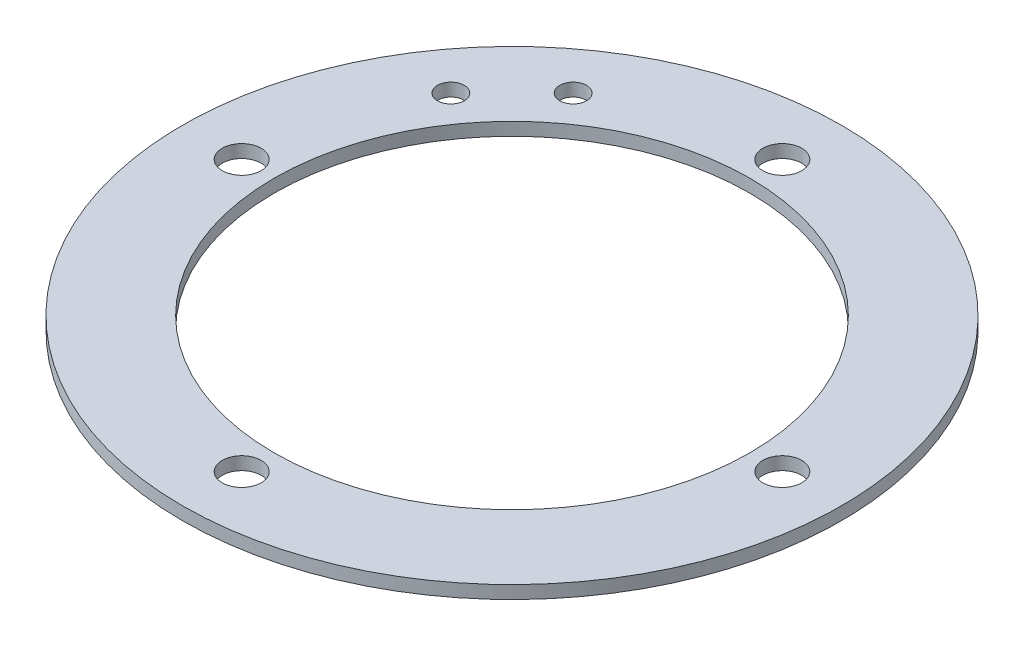
ISO-10303-21;
HEADER;
FILE_DESCRIPTION(('STEP AP214'),'2;1');
FILE_NAME('part.step','',(''),(''),'','','');
FILE_SCHEMA(('AUTOMOTIVE_DESIGN { 1 0 10303 214 1 1 1 1 }'));
ENDSEC;
DATA;
#1=APPLICATION_CONTEXT('core data for automotive mechanical design processes');
#2=APPLICATION_PROTOCOL_DEFINITION('international standard','automotive_design',2000,#1);
#3=PRODUCT_CONTEXT('',#1,'mechanical');
#4=PRODUCT('Part','Part','',(#3));
#5=PRODUCT_RELATED_PRODUCT_CATEGORY('part','',(#4));
#6=PRODUCT_DEFINITION_FORMATION('','',#4);
#7=PRODUCT_DEFINITION_CONTEXT('part definition',#1,'design');
#8=PRODUCT_DEFINITION('design','',#6,#7);
#9=PRODUCT_DEFINITION_SHAPE('','',#8);
#10=(LENGTH_UNIT() NAMED_UNIT(*) SI_UNIT(.MILLI.,.METRE.));
#11=(NAMED_UNIT(*) PLANE_ANGLE_UNIT() SI_UNIT($,.RADIAN.));
#12=(NAMED_UNIT(*) SI_UNIT($,.STERADIAN.) SOLID_ANGLE_UNIT());
#13=UNCERTAINTY_MEASURE_WITH_UNIT(LENGTH_MEASURE(1.E-05),#10,'distance_accuracy_value','');
#14=(GEOMETRIC_REPRESENTATION_CONTEXT(3) GLOBAL_UNCERTAINTY_ASSIGNED_CONTEXT((#13)) GLOBAL_UNIT_ASSIGNED_CONTEXT((#10,
#11,#12)) REPRESENTATION_CONTEXT('',''));
#15=CARTESIAN_POINT('',(0.,0.,0.));
#16=DIRECTION('',(0.,0.,1.));
#17=DIRECTION('',(1.,0.,0.));
#18=AXIS2_PLACEMENT_3D('',#15,#16,#17);
#19=CARTESIAN_POINT('',(0.,3.,0.));
#20=DIRECTION('',(0.,1.,0.));
#21=DIRECTION('',(0.,0.,1.));
#22=AXIS2_PLACEMENT_3D('',#19,#20,#21);
#23=PLANE('',#22);
#24=CARTESIAN_POINT('',(-51.6187950266179,3.,-37.4766594028871));
#25=DIRECTION('',(0.,1.,0.));
#26=DIRECTION('',(0.,0.,1.));
#27=AXIS2_PLACEMENT_3D('',#24,#25,#26);
#28=CIRCLE('',#27,3.09999999999999);
#29=CARTESIAN_POINT('',(-51.6187950266179,3.,-34.3766594028871));
#30=VERTEX_POINT('',#29);
#31=EDGE_CURVE('E86',#30,#30,#28,.T.);
#32=ORIENTED_EDGE('',*,*,#31,.F.);
#33=EDGE_LOOP('',(#32));
#34=FACE_BOUND('',#33,.T.);
#35=CARTESIAN_POINT('',(-37.4766594028869,3.,-51.618795026618));
#36=DIRECTION('',(0.,1.,0.));
#37=DIRECTION('',(0.,0.,1.));
#38=AXIS2_PLACEMENT_3D('',#35,#36,#37);
#39=CIRCLE('',#38,3.09999999999999);
#40=CARTESIAN_POINT('',(-37.4766594028869,3.,-48.518795026618));
#41=VERTEX_POINT('',#40);
#42=EDGE_CURVE('E80',#41,#41,#39,.T.);
#43=ORIENTED_EDGE('',*,*,#42,.F.);
#44=EDGE_LOOP('',(#43));
#45=FACE_BOUND('',#44,.T.);
#46=CARTESIAN_POINT('',(0.,3.,62.5));
#47=DIRECTION('',(0.,1.,0.));
#48=DIRECTION('',(0.,0.,1.));
#49=AXIS2_PLACEMENT_3D('',#46,#47,#48);
#50=CIRCLE('',#49,4.5);
#51=CARTESIAN_POINT('',(0.,3.,67.));
#52=VERTEX_POINT('',#51);
#53=EDGE_CURVE('E65',#52,#52,#50,.T.);
#54=ORIENTED_EDGE('',*,*,#53,.F.);
#55=EDGE_LOOP('',(#54));
#56=FACE_BOUND('',#55,.T.);
#57=CARTESIAN_POINT('',(0.,3.,0.));
#58=DIRECTION('',(0.,1.,0.));
#59=DIRECTION('',(0.,0.,1.));
#60=AXIS2_PLACEMENT_3D('',#57,#58,#59);
#61=CIRCLE('',#60,55.);
#62=CARTESIAN_POINT('',(0.,3.,55.));
#63=VERTEX_POINT('',#62);
#64=EDGE_CURVE('E53',#63,#63,#61,.T.);
#65=ORIENTED_EDGE('',*,*,#64,.F.);
#66=EDGE_LOOP('',(#65));
#67=FACE_BOUND('',#66,.T.);
#68=CARTESIAN_POINT('',(0.,3.,0.));
#69=DIRECTION('',(0.,1.,0.));
#70=DIRECTION('',(0.,0.,1.));
#71=AXIS2_PLACEMENT_3D('',#68,#69,#70);
#72=CIRCLE('',#71,76.2);
#73=CARTESIAN_POINT('',(0.,3.,76.2));
#74=VERTEX_POINT('',#73);
#75=EDGE_CURVE('E10',#74,#74,#72,.T.);
#76=ORIENTED_EDGE('',*,*,#75,.T.);
#77=EDGE_LOOP('',(#76));
#78=FACE_BOUND('',#77,.T.);
#79=CARTESIAN_POINT('',(0.,3.,-62.5));
#80=DIRECTION('',(0.,1.,0.));
#81=DIRECTION('',(0.,0.,1.));
#82=AXIS2_PLACEMENT_3D('',#79,#80,#81);
#83=CIRCLE('',#82,4.5);
#84=CARTESIAN_POINT('',(0.,3.,-58.));
#85=VERTEX_POINT('',#84);
#86=EDGE_CURVE('E48',#85,#85,#83,.T.);
#87=ORIENTED_EDGE('',*,*,#86,.F.);
#88=EDGE_LOOP('',(#87));
#89=FACE_BOUND('',#88,.T.);
#90=CARTESIAN_POINT('',(62.5,3.,0.));
#91=DIRECTION('',(0.,1.,0.));
#92=DIRECTION('',(0.,0.,1.));
#93=AXIS2_PLACEMENT_3D('',#90,#91,#92);
#94=CIRCLE('',#93,4.5);
#95=CARTESIAN_POINT('',(62.5,3.,4.5));
#96=VERTEX_POINT('',#95);
#97=EDGE_CURVE('E59',#96,#96,#94,.T.);
#98=ORIENTED_EDGE('',*,*,#97,.F.);
#99=EDGE_LOOP('',(#98));
#100=FACE_BOUND('',#99,.T.);
#101=CARTESIAN_POINT('',(-62.5,3.,0.));
#102=DIRECTION('',(0.,1.,0.));
#103=DIRECTION('',(0.,0.,1.));
#104=AXIS2_PLACEMENT_3D('',#101,#102,#103);
#105=CIRCLE('',#104,4.5);
#106=CARTESIAN_POINT('',(-62.5,3.,4.49999999999999));
#107=VERTEX_POINT('',#106);
#108=EDGE_CURVE('E71',#107,#107,#105,.T.);
#109=ORIENTED_EDGE('',*,*,#108,.F.);
#110=EDGE_LOOP('',(#109));
#111=FACE_BOUND('',#110,.T.);
#112=ADVANCED_FACE('F37',(#34,#45,#56,#67,#78,#89,#100,#111),#23,.T.);
#113=CARTESIAN_POINT('',(0.,0.,0.));
#114=DIRECTION('',(0.,1.,0.));
#115=DIRECTION('',(0.,0.,1.));
#116=AXIS2_PLACEMENT_3D('',#113,#114,#115);
#117=PLANE('',#116);
#118=CARTESIAN_POINT('',(-51.6187950266179,0.,-37.4766594028871));
#119=DIRECTION('',(0.,1.,0.));
#120=DIRECTION('',(0.,0.,1.));
#121=AXIS2_PLACEMENT_3D('',#118,#119,#120);
#122=CIRCLE('',#121,3.09999999999999);
#123=CARTESIAN_POINT('',(-51.6187950266179,0.,-34.3766594028871));
#124=VERTEX_POINT('',#123);
#125=EDGE_CURVE('E77',#124,#124,#122,.T.);
#126=ORIENTED_EDGE('',*,*,#125,.T.);
#127=EDGE_LOOP('',(#126));
#128=FACE_BOUND('',#127,.T.);
#129=CARTESIAN_POINT('',(-37.4766594028869,0.,-51.618795026618));
#130=DIRECTION('',(0.,1.,0.));
#131=DIRECTION('',(0.,0.,1.));
#132=AXIS2_PLACEMENT_3D('',#129,#130,#131);
#133=CIRCLE('',#132,3.09999999999999);
#134=CARTESIAN_POINT('',(-37.4766594028869,0.,-48.518795026618));
#135=VERTEX_POINT('',#134);
#136=EDGE_CURVE('E83',#135,#135,#133,.T.);
#137=ORIENTED_EDGE('',*,*,#136,.T.);
#138=EDGE_LOOP('',(#137));
#139=FACE_BOUND('',#138,.T.);
#140=CARTESIAN_POINT('',(0.,0.,0.));
#141=DIRECTION('',(0.,1.,0.));
#142=DIRECTION('',(0.,0.,1.));
#143=AXIS2_PLACEMENT_3D('',#140,#141,#142);
#144=CIRCLE('',#143,76.2);
#145=CARTESIAN_POINT('',(0.,0.,76.2));
#146=VERTEX_POINT('',#145);
#147=EDGE_CURVE('E41',#146,#146,#144,.T.);
#148=ORIENTED_EDGE('',*,*,#147,.F.);
#149=EDGE_LOOP('',(#148));
#150=FACE_BOUND('',#149,.T.);
#151=CARTESIAN_POINT('',(0.,0.,-62.5));
#152=DIRECTION('',(0.,1.,0.));
#153=DIRECTION('',(0.,0.,1.));
#154=AXIS2_PLACEMENT_3D('',#151,#152,#153);
#155=CIRCLE('',#154,4.5);
#156=CARTESIAN_POINT('',(0.,0.,-58.));
#157=VERTEX_POINT('',#156);
#158=EDGE_CURVE('E50',#157,#157,#155,.T.);
#159=ORIENTED_EDGE('',*,*,#158,.T.);
#160=EDGE_LOOP('',(#159));
#161=FACE_BOUND('',#160,.T.);
#162=CARTESIAN_POINT('',(0.,0.,0.));
#163=DIRECTION('',(0.,1.,0.));
#164=DIRECTION('',(0.,0.,1.));
#165=AXIS2_PLACEMENT_3D('',#162,#163,#164);
#166=CIRCLE('',#165,55.);
#167=CARTESIAN_POINT('',(0.,0.,55.));
#168=VERTEX_POINT('',#167);
#169=EDGE_CURVE('E56',#168,#168,#166,.T.);
#170=ORIENTED_EDGE('',*,*,#169,.T.);
#171=EDGE_LOOP('',(#170));
#172=FACE_BOUND('',#171,.T.);
#173=CARTESIAN_POINT('',(62.5,0.,0.));
#174=DIRECTION('',(0.,1.,0.));
#175=DIRECTION('',(0.,0.,1.));
#176=AXIS2_PLACEMENT_3D('',#173,#174,#175);
#177=CIRCLE('',#176,4.5);
#178=CARTESIAN_POINT('',(62.5,0.,4.5));
#179=VERTEX_POINT('',#178);
#180=EDGE_CURVE('E62',#179,#179,#177,.T.);
#181=ORIENTED_EDGE('',*,*,#180,.T.);
#182=EDGE_LOOP('',(#181));
#183=FACE_BOUND('',#182,.T.);
#184=CARTESIAN_POINT('',(0.,0.,62.5));
#185=DIRECTION('',(0.,1.,0.));
#186=DIRECTION('',(0.,0.,1.));
#187=AXIS2_PLACEMENT_3D('',#184,#185,#186);
#188=CIRCLE('',#187,4.5);
#189=CARTESIAN_POINT('',(0.,0.,67.));
#190=VERTEX_POINT('',#189);
#191=EDGE_CURVE('E68',#190,#190,#188,.T.);
#192=ORIENTED_EDGE('',*,*,#191,.T.);
#193=EDGE_LOOP('',(#192));
#194=FACE_BOUND('',#193,.T.);
#195=CARTESIAN_POINT('',(-62.5,0.,0.));
#196=DIRECTION('',(0.,1.,0.));
#197=DIRECTION('',(0.,0.,1.));
#198=AXIS2_PLACEMENT_3D('',#195,#196,#197);
#199=CIRCLE('',#198,4.5);
#200=CARTESIAN_POINT('',(-62.5,0.,4.49999999999999));
#201=VERTEX_POINT('',#200);
#202=EDGE_CURVE('E74',#201,#201,#199,.T.);
#203=ORIENTED_EDGE('',*,*,#202,.T.);
#204=EDGE_LOOP('',(#203));
#205=FACE_BOUND('',#204,.T.);
#206=ADVANCED_FACE('F92',(#128,#139,#150,#161,#172,#183,#194,#205),#117,.F.);
#207=CARTESIAN_POINT('',(0.,3.,0.));
#208=DIRECTION('',(0.,-1.,0.));
#209=DIRECTION('',(0.,0.,-1.));
#210=AXIS2_PLACEMENT_3D('',#207,#208,#209);
#211=CYLINDRICAL_SURFACE('',#210,76.2);
#212=ORIENTED_EDGE('',*,*,#75,.F.);
#213=EDGE_LOOP('',(#212));
#214=FACE_BOUND('',#213,.T.);
#215=ORIENTED_EDGE('',*,*,#147,.T.);
#216=EDGE_LOOP('',(#215));
#217=FACE_BOUND('',#216,.T.);
#218=ADVANCED_FACE('F39',(#214,#217),#211,.T.);
#219=CARTESIAN_POINT('',(0.,3.,-62.5));
#220=DIRECTION('',(0.,-1.,0.));
#221=DIRECTION('',(0.,0.,-1.));
#222=AXIS2_PLACEMENT_3D('',#219,#220,#221);
#223=CYLINDRICAL_SURFACE('',#222,4.5);
#224=ORIENTED_EDGE('',*,*,#86,.T.);
#225=EDGE_LOOP('',(#224));
#226=FACE_BOUND('',#225,.T.);
#227=ORIENTED_EDGE('',*,*,#158,.F.);
#228=EDGE_LOOP('',(#227));
#229=FACE_BOUND('',#228,.T.);
#230=ADVANCED_FACE('F129',(#226,#229),#223,.F.);
#231=CARTESIAN_POINT('',(0.,3.,0.));
#232=DIRECTION('',(0.,-1.,0.));
#233=DIRECTION('',(0.,0.,-1.));
#234=AXIS2_PLACEMENT_3D('',#231,#232,#233);
#235=CYLINDRICAL_SURFACE('',#234,55.);
#236=ORIENTED_EDGE('',*,*,#64,.T.);
#237=EDGE_LOOP('',(#236));
#238=FACE_BOUND('',#237,.T.);
#239=ORIENTED_EDGE('',*,*,#169,.F.);
#240=EDGE_LOOP('',(#239));
#241=FACE_BOUND('',#240,.T.);
#242=ADVANCED_FACE('F134',(#238,#241),#235,.F.);
#243=CARTESIAN_POINT('',(62.5,3.,0.));
#244=DIRECTION('',(0.,-1.,0.));
#245=DIRECTION('',(0.,0.,-1.));
#246=AXIS2_PLACEMENT_3D('',#243,#244,#245);
#247=CYLINDRICAL_SURFACE('',#246,4.5);
#248=ORIENTED_EDGE('',*,*,#97,.T.);
#249=EDGE_LOOP('',(#248));
#250=FACE_BOUND('',#249,.T.);
#251=ORIENTED_EDGE('',*,*,#180,.F.);
#252=EDGE_LOOP('',(#251));
#253=FACE_BOUND('',#252,.T.);
#254=ADVANCED_FACE('F138',(#250,#253),#247,.F.);
#255=CARTESIAN_POINT('',(0.,3.,62.5));
#256=DIRECTION('',(0.,-1.,0.));
#257=DIRECTION('',(0.,0.,-1.));
#258=AXIS2_PLACEMENT_3D('',#255,#256,#257);
#259=CYLINDRICAL_SURFACE('',#258,4.5);
#260=ORIENTED_EDGE('',*,*,#53,.T.);
#261=EDGE_LOOP('',(#260));
#262=FACE_BOUND('',#261,.T.);
#263=ORIENTED_EDGE('',*,*,#191,.F.);
#264=EDGE_LOOP('',(#263));
#265=FACE_BOUND('',#264,.T.);
#266=ADVANCED_FACE('F120',(#262,#265),#259,.F.);
#267=CARTESIAN_POINT('',(-62.5,3.,0.));
#268=DIRECTION('',(0.,-1.,0.));
#269=DIRECTION('',(0.,0.,-1.));
#270=AXIS2_PLACEMENT_3D('',#267,#268,#269);
#271=CYLINDRICAL_SURFACE('',#270,4.5);
#272=ORIENTED_EDGE('',*,*,#108,.T.);
#273=EDGE_LOOP('',(#272));
#274=FACE_BOUND('',#273,.T.);
#275=ORIENTED_EDGE('',*,*,#202,.F.);
#276=EDGE_LOOP('',(#275));
#277=FACE_BOUND('',#276,.T.);
#278=ADVANCED_FACE('F117',(#274,#277),#271,.F.);
#279=CARTESIAN_POINT('',(-37.4766594028869,0.,-51.618795026618));
#280=DIRECTION('',(0.,1.,0.));
#281=DIRECTION('',(0.,0.,1.));
#282=AXIS2_PLACEMENT_3D('',#279,#280,#281);
#283=CYLINDRICAL_SURFACE('',#282,3.09999999999999);
#284=ORIENTED_EDGE('',*,*,#136,.F.);
#285=EDGE_LOOP('',(#284));
#286=FACE_BOUND('',#285,.T.);
#287=ORIENTED_EDGE('',*,*,#42,.T.);
#288=EDGE_LOOP('',(#287));
#289=FACE_BOUND('',#288,.T.);
#290=ADVANCED_FACE('F98',(#286,#289),#283,.F.);
#291=CARTESIAN_POINT('',(-51.6187950266179,0.,-37.4766594028871));
#292=DIRECTION('',(0.,1.,0.));
#293=DIRECTION('',(0.,0.,1.));
#294=AXIS2_PLACEMENT_3D('',#291,#292,#293);
#295=CYLINDRICAL_SURFACE('',#294,3.09999999999999);
#296=ORIENTED_EDGE('',*,*,#125,.F.);
#297=EDGE_LOOP('',(#296));
#298=FACE_BOUND('',#297,.T.);
#299=ORIENTED_EDGE('',*,*,#31,.T.);
#300=EDGE_LOOP('',(#299));
#301=FACE_BOUND('',#300,.T.);
#302=ADVANCED_FACE('F95',(#298,#301),#295,.F.);
#303=CLOSED_SHELL('',(#112,#206,#218,#230,#242,#254,#266,#278,#290,#302));
#304=MANIFOLD_SOLID_BREP('B2',#303);
#305=ADVANCED_BREP_SHAPE_REPRESENTATION('',(#18,#304),#14);
#306=SHAPE_DEFINITION_REPRESENTATION(#9,#305);
ENDSEC;
END-ISO-10303-21;
